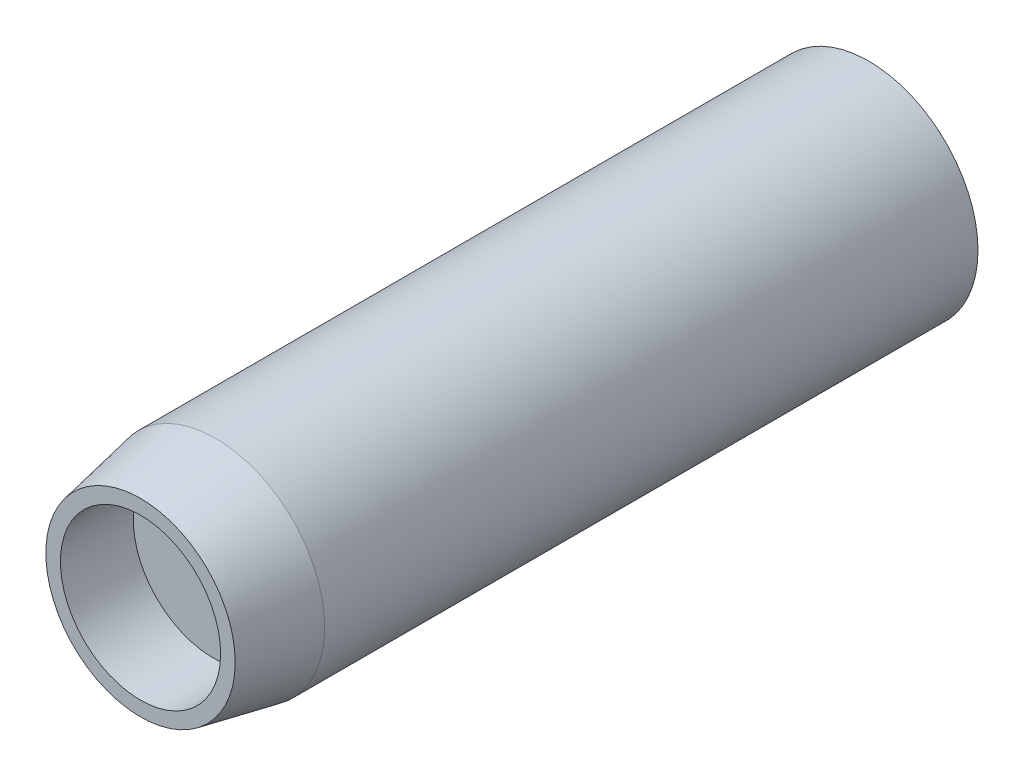
ISO-10303-21;
HEADER;
FILE_DESCRIPTION(('STEP AP214'),'2;1');
FILE_NAME('part.step','',(''),(''),'','','');
FILE_SCHEMA(('AUTOMOTIVE_DESIGN { 1 0 10303 214 1 1 1 1 }'));
ENDSEC;
DATA;
#1=APPLICATION_CONTEXT('core data for automotive mechanical design processes');
#2=APPLICATION_PROTOCOL_DEFINITION('international standard','automotive_design',2000,#1);
#3=PRODUCT_CONTEXT('',#1,'mechanical');
#4=PRODUCT('Part','Part','',(#3));
#5=PRODUCT_RELATED_PRODUCT_CATEGORY('part','',(#4));
#6=PRODUCT_DEFINITION_FORMATION('','',#4);
#7=PRODUCT_DEFINITION_CONTEXT('part definition',#1,'design');
#8=PRODUCT_DEFINITION('design','',#6,#7);
#9=PRODUCT_DEFINITION_SHAPE('','',#8);
#10=(LENGTH_UNIT() NAMED_UNIT(*) SI_UNIT(.MILLI.,.METRE.));
#11=(NAMED_UNIT(*) PLANE_ANGLE_UNIT() SI_UNIT($,.RADIAN.));
#12=(NAMED_UNIT(*) SI_UNIT($,.STERADIAN.) SOLID_ANGLE_UNIT());
#13=UNCERTAINTY_MEASURE_WITH_UNIT(LENGTH_MEASURE(1.E-05),#10,'distance_accuracy_value','');
#14=(GEOMETRIC_REPRESENTATION_CONTEXT(3) GLOBAL_UNCERTAINTY_ASSIGNED_CONTEXT((#13)) GLOBAL_UNIT_ASSIGNED_CONTEXT((#10,
#11,#12)) REPRESENTATION_CONTEXT('',''));
#15=CARTESIAN_POINT('',(0.,0.,0.));
#16=DIRECTION('',(0.,0.,1.));
#17=DIRECTION('',(1.,0.,0.));
#18=AXIS2_PLACEMENT_3D('',#15,#16,#17);
#19=CARTESIAN_POINT('',(0.,0.,50.));
#20=DIRECTION('',(0.,0.,-1.));
#21=DIRECTION('',(-1.,0.,0.));
#22=AXIS2_PLACEMENT_3D('',#19,#20,#21);
#23=CYLINDRICAL_SURFACE('',#22,7.5);
#24=CARTESIAN_POINT('',(0.,0.,44.8554459840298));
#25=DIRECTION('',(0.,0.,1.));
#26=DIRECTION('',(1.,0.,0.));
#27=AXIS2_PLACEMENT_3D('',#24,#25,#26);
#28=CIRCLE('',#27,7.5);
#29=CARTESIAN_POINT('',(7.5,0.,44.8554459840298));
#30=VERTEX_POINT('',#29);
#31=EDGE_CURVE('E10',#30,#30,#28,.F.);
#32=ORIENTED_EDGE('',*,*,#31,.T.);
#33=EDGE_LOOP('',(#32));
#34=FACE_BOUND('',#33,.T.);
#35=CARTESIAN_POINT('',(0.,0.,0.));
#36=DIRECTION('',(0.,0.,1.));
#37=DIRECTION('',(1.,0.,0.));
#38=AXIS2_PLACEMENT_3D('',#35,#36,#37);
#39=CIRCLE('',#38,7.5);
#40=CARTESIAN_POINT('',(7.5,0.,0.));
#41=VERTEX_POINT('',#40);
#42=EDGE_CURVE('E49',#41,#41,#39,.T.);
#43=ORIENTED_EDGE('',*,*,#42,.T.);
#44=EDGE_LOOP('',(#43));
#45=FACE_BOUND('',#44,.T.);
#46=ADVANCED_FACE('F37',(#34,#45),#23,.T.);
#47=CARTESIAN_POINT('',(0.,0.,50.));
#48=DIRECTION('',(0.,0.,1.));
#49=DIRECTION('',(1.,0.,0.));
#50=AXIS2_PLACEMENT_3D('',#47,#48,#49);
#51=PLANE('',#50);
#52=CARTESIAN_POINT('',(0.,0.,50.));
#53=DIRECTION('',(0.,0.,1.));
#54=DIRECTION('',(1.,0.,0.));
#55=AXIS2_PLACEMENT_3D('',#52,#53,#54);
#56=CIRCLE('',#55,6.49999999999999);
#57=CARTESIAN_POINT('',(6.49999999999999,0.,50.));
#58=VERTEX_POINT('',#57);
#59=EDGE_CURVE('E45',#58,#58,#56,.T.);
#60=ORIENTED_EDGE('',*,*,#59,.T.);
#61=EDGE_LOOP('',(#60));
#62=FACE_BOUND('',#61,.T.);
#63=CARTESIAN_POINT('',(0.,0.,50.));
#64=DIRECTION('',(0.,0.,1.));
#65=DIRECTION('',(1.,0.,0.));
#66=AXIS2_PLACEMENT_3D('',#63,#64,#65);
#67=CIRCLE('',#66,5.5);
#68=CARTESIAN_POINT('',(5.5,0.,50.));
#69=VERTEX_POINT('',#68);
#70=EDGE_CURVE('E56',#69,#69,#67,.T.);
#71=ORIENTED_EDGE('',*,*,#70,.F.);
#72=EDGE_LOOP('',(#71));
#73=FACE_BOUND('',#72,.T.);
#74=ADVANCED_FACE('F71',(#62,#73),#51,.T.);
#75=CARTESIAN_POINT('',(0.,0.,0.));
#76=DIRECTION('',(0.,0.,1.));
#77=DIRECTION('',(1.,0.,0.));
#78=AXIS2_PLACEMENT_3D('',#75,#76,#77);
#79=PLANE('',#78);
#80=ORIENTED_EDGE('',*,*,#42,.F.);
#81=EDGE_LOOP('',(#80));
#82=FACE_BOUND('',#81,.T.);
#83=ADVANCED_FACE('F67',(#82),#79,.F.);
#84=CARTESIAN_POINT('',(0.,0.,45.));
#85=DIRECTION('',(0.,0.,1.));
#86=DIRECTION('',(1.,0.,0.));
#87=AXIS2_PLACEMENT_3D('',#84,#85,#86);
#88=CYLINDRICAL_SURFACE('',#87,5.5);
#89=CARTESIAN_POINT('',(0.,0.,45.));
#90=DIRECTION('',(0.,0.,1.));
#91=DIRECTION('',(1.,0.,0.));
#92=AXIS2_PLACEMENT_3D('',#89,#90,#91);
#93=CIRCLE('',#92,5.5);
#94=CARTESIAN_POINT('',(5.5,0.,45.));
#95=VERTEX_POINT('',#94);
#96=EDGE_CURVE('E53',#95,#95,#93,.T.);
#97=ORIENTED_EDGE('',*,*,#96,.F.);
#98=EDGE_LOOP('',(#97));
#99=FACE_BOUND('',#98,.T.);
#100=ORIENTED_EDGE('',*,*,#70,.T.);
#101=EDGE_LOOP('',(#100));
#102=FACE_BOUND('',#101,.T.);
#103=ADVANCED_FACE('F64',(#99,#102),#88,.F.);
#104=CARTESIAN_POINT('',(0.,0.,45.));
#105=DIRECTION('',(0.,0.,1.));
#106=DIRECTION('',(1.,0.,0.));
#107=AXIS2_PLACEMENT_3D('',#104,#105,#106);
#108=PLANE('',#107);
#109=ORIENTED_EDGE('',*,*,#96,.T.);
#110=EDGE_LOOP('',(#109));
#111=FACE_BOUND('',#110,.T.);
#112=ADVANCED_FACE('F62',(#111),#108,.T.);
#113=CARTESIAN_POINT('',(0.,0.,50.));
#114=DIRECTION('',(0.,0.,-1.));
#115=DIRECTION('',(-1.,0.,0.));
#116=AXIS2_PLACEMENT_3D('',#113,#114,#115);
#117=CONICAL_SURFACE('',#116,6.49999999999999,0.191986217719381);
#118=ORIENTED_EDGE('',*,*,#31,.F.);
#119=EDGE_LOOP('',(#118));
#120=FACE_BOUND('',#119,.T.);
#121=ORIENTED_EDGE('',*,*,#59,.F.);
#122=EDGE_LOOP('',(#121));
#123=FACE_BOUND('',#122,.T.);
#124=ADVANCED_FACE('F40',(#120,#123),#117,.T.);
#125=CLOSED_SHELL('',(#46,#74,#83,#103,#112,#124));
#126=MANIFOLD_SOLID_BREP('B2',#125);
#127=ADVANCED_BREP_SHAPE_REPRESENTATION('',(#18,#126),#14);
#128=SHAPE_DEFINITION_REPRESENTATION(#9,#127);
ENDSEC;
END-ISO-10303-21;
